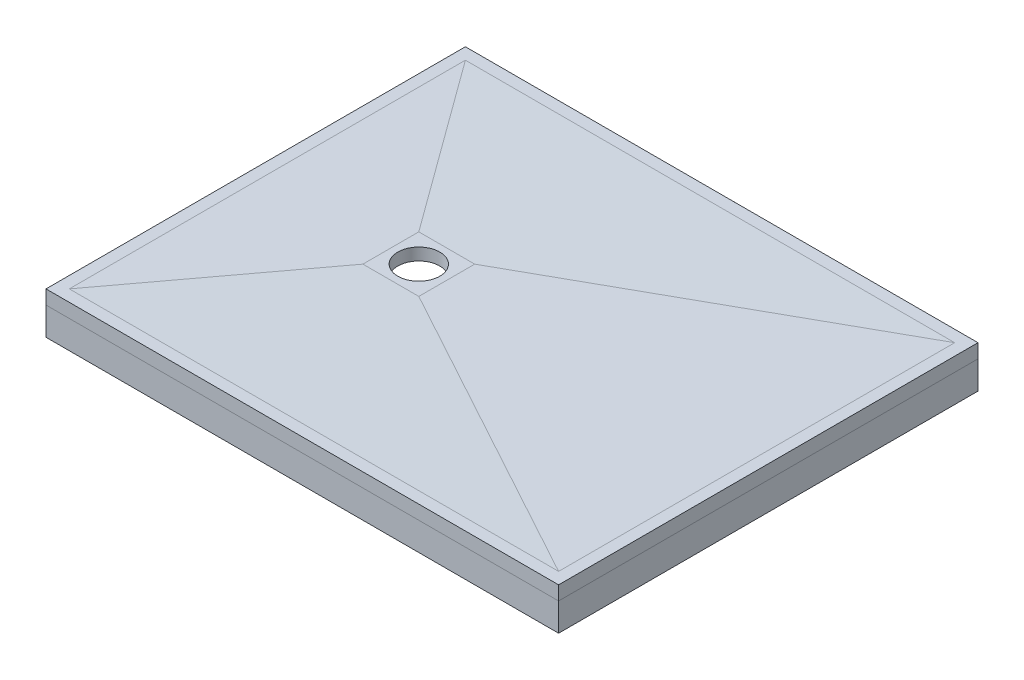
ISO-10303-21;
HEADER;
FILE_DESCRIPTION(('STEP AP214'),'2;1');
FILE_NAME('part.step','',(''),(''),'','','');
FILE_SCHEMA(('AUTOMOTIVE_DESIGN { 1 0 10303 214 1 1 1 1 }'));
ENDSEC;
DATA;
#1=APPLICATION_CONTEXT('core data for automotive mechanical design processes');
#2=APPLICATION_PROTOCOL_DEFINITION('international standard','automotive_design',2000,#1);
#3=PRODUCT_CONTEXT('',#1,'mechanical');
#4=PRODUCT('Part','Part','',(#3));
#5=PRODUCT_RELATED_PRODUCT_CATEGORY('part','',(#4));
#6=PRODUCT_DEFINITION_FORMATION('','',#4);
#7=PRODUCT_DEFINITION_CONTEXT('part definition',#1,'design');
#8=PRODUCT_DEFINITION('design','',#6,#7);
#9=PRODUCT_DEFINITION_SHAPE('','',#8);
#10=(LENGTH_UNIT() NAMED_UNIT(*) SI_UNIT(.MILLI.,.METRE.));
#11=(NAMED_UNIT(*) PLANE_ANGLE_UNIT() SI_UNIT($,.RADIAN.));
#12=(NAMED_UNIT(*) SI_UNIT($,.STERADIAN.) SOLID_ANGLE_UNIT());
#13=UNCERTAINTY_MEASURE_WITH_UNIT(LENGTH_MEASURE(1.E-05),#10,'distance_accuracy_value','');
#14=(GEOMETRIC_REPRESENTATION_CONTEXT(3) GLOBAL_UNCERTAINTY_ASSIGNED_CONTEXT((#13)) GLOBAL_UNIT_ASSIGNED_CONTEXT((#10,
#11,#12)) REPRESENTATION_CONTEXT('',''));
#15=CARTESIAN_POINT('',(0.,0.,0.));
#16=DIRECTION('',(0.,0.,1.));
#17=DIRECTION('',(1.,0.,0.));
#18=AXIS2_PLACEMENT_3D('',#15,#16,#17);
#19=CARTESIAN_POINT('',(0.,-1571.26704035519,0.));
#20=DIRECTION('',(0.,0.,-1.));
#21=DIRECTION('',(-1.,0.,0.));
#22=AXIS2_PLACEMENT_3D('',#19,#20,#21);
#23=PLANE('',#22);
#24=DIRECTION('',(-1.,0.,0.));
#25=VECTOR('',#24,1.);
#26=CARTESIAN_POINT('',(0.,-60.0000000000001,0.));
#27=LINE('',#26,#25);
#28=CARTESIAN_POINT('',(1100.,-60.0000000000001,0.));
#29=VERTEX_POINT('',#28);
#30=CARTESIAN_POINT('',(0.,-60.0000000000001,0.));
#31=VERTEX_POINT('',#30);
#32=EDGE_CURVE('E184',#29,#31,#27,.T.);
#33=ORIENTED_EDGE('',*,*,#32,.F.);
#34=DIRECTION('',(0.,1.,0.));
#35=VECTOR('',#34,1.);
#36=CARTESIAN_POINT('',(1100.,-1571.26704035519,0.));
#37=LINE('',#36,#35);
#38=CARTESIAN_POINT('',(1100.,0.,0.));
#39=VERTEX_POINT('',#38);
#40=EDGE_CURVE('E75',#29,#39,#37,.T.);
#41=ORIENTED_EDGE('',*,*,#40,.T.);
#42=DIRECTION('',(-1.,0.,0.));
#43=VECTOR('',#42,1.);
#44=CARTESIAN_POINT('',(0.,0.,0.));
#45=LINE('',#44,#43);
#46=CARTESIAN_POINT('',(0.,0.,0.));
#47=VERTEX_POINT('',#46);
#48=EDGE_CURVE('E158',#39,#47,#45,.T.);
#49=ORIENTED_EDGE('',*,*,#48,.T.);
#50=DIRECTION('',(0.,1.,0.));
#51=VECTOR('',#50,1.);
#52=CARTESIAN_POINT('',(0.,-1571.26704035519,0.));
#53=LINE('',#52,#51);
#54=EDGE_CURVE('E161',#31,#47,#53,.T.);
#55=ORIENTED_EDGE('',*,*,#54,.F.);
#56=EDGE_LOOP('',(#33,#41,#49,#55));
#57=FACE_BOUND('',#56,.T.);
#58=ADVANCED_FACE('F60',(#57),#23,.F.);
#59=CARTESIAN_POINT('',(1100.,-1571.26704035519,0.));
#60=DIRECTION('',(-1.,0.,0.));
#61=DIRECTION('',(0.,0.,1.));
#62=AXIS2_PLACEMENT_3D('',#59,#60,#61);
#63=PLANE('',#62);
#64=DIRECTION('',(0.,0.,1.));
#65=VECTOR('',#64,1.);
#66=CARTESIAN_POINT('',(1100.,-60.0000000000001,0.));
#67=LINE('',#66,#65);
#68=CARTESIAN_POINT('',(1100.,-60.0000000000001,-900.));
#69=VERTEX_POINT('',#68);
#70=EDGE_CURVE('E187',#69,#29,#67,.T.);
#71=ORIENTED_EDGE('',*,*,#70,.F.);
#72=DIRECTION('',(0.,1.,0.));
#73=VECTOR('',#72,1.);
#74=CARTESIAN_POINT('',(1100.,-1571.26704035519,-900.));
#75=LINE('',#74,#73);
#76=CARTESIAN_POINT('',(1100.,0.,-900.));
#77=VERTEX_POINT('',#76);
#78=EDGE_CURVE('E164',#69,#77,#75,.T.);
#79=ORIENTED_EDGE('',*,*,#78,.T.);
#80=DIRECTION('',(0.,0.,1.));
#81=VECTOR('',#80,1.);
#82=CARTESIAN_POINT('',(1100.,0.,0.));
#83=LINE('',#82,#81);
#84=EDGE_CURVE('E156',#77,#39,#83,.T.);
#85=ORIENTED_EDGE('',*,*,#84,.T.);
#86=ORIENTED_EDGE('',*,*,#40,.F.);
#87=EDGE_LOOP('',(#71,#79,#85,#86));
#88=FACE_BOUND('',#87,.T.);
#89=ADVANCED_FACE('F186',(#88),#63,.F.);
#90=CARTESIAN_POINT('',(0.,-1571.26704035519,-900.));
#91=DIRECTION('',(0.,0.,1.));
#92=DIRECTION('',(1.,0.,0.));
#93=AXIS2_PLACEMENT_3D('',#90,#91,#92);
#94=PLANE('',#93);
#95=DIRECTION('',(1.,0.,0.));
#96=VECTOR('',#95,1.);
#97=CARTESIAN_POINT('',(0.,-60.0000000000001,-900.));
#98=LINE('',#97,#96);
#99=CARTESIAN_POINT('',(0.,-60.0000000000001,-900.));
#100=VERTEX_POINT('',#99);
#101=EDGE_CURVE('E172',#100,#69,#98,.T.);
#102=ORIENTED_EDGE('',*,*,#101,.F.);
#103=DIRECTION('',(0.,1.,0.));
#104=VECTOR('',#103,1.);
#105=CARTESIAN_POINT('',(0.,-1571.26704035519,-900.));
#106=LINE('',#105,#104);
#107=CARTESIAN_POINT('',(0.,0.,-900.));
#108=VERTEX_POINT('',#107);
#109=EDGE_CURVE('E68',#100,#108,#106,.T.);
#110=ORIENTED_EDGE('',*,*,#109,.T.);
#111=DIRECTION('',(1.,0.,0.));
#112=VECTOR('',#111,1.);
#113=CARTESIAN_POINT('',(0.,0.,-900.));
#114=LINE('',#113,#112);
#115=EDGE_CURVE('E153',#108,#77,#114,.T.);
#116=ORIENTED_EDGE('',*,*,#115,.T.);
#117=ORIENTED_EDGE('',*,*,#78,.F.);
#118=EDGE_LOOP('',(#102,#110,#116,#117));
#119=FACE_BOUND('',#118,.T.);
#120=ADVANCED_FACE('F168',(#119),#94,.F.);
#121=CARTESIAN_POINT('',(0.,-1571.26704035519,0.));
#122=DIRECTION('',(1.,0.,0.));
#123=DIRECTION('',(0.,0.,-1.));
#124=AXIS2_PLACEMENT_3D('',#121,#122,#123);
#125=PLANE('',#124);
#126=DIRECTION('',(0.,0.,-1.));
#127=VECTOR('',#126,1.);
#128=CARTESIAN_POINT('',(0.,-60.0000000000001,0.));
#129=LINE('',#128,#127);
#130=EDGE_CURVE('E181',#31,#100,#129,.T.);
#131=ORIENTED_EDGE('',*,*,#130,.F.);
#132=ORIENTED_EDGE('',*,*,#54,.T.);
#133=DIRECTION('',(0.,0.,-1.));
#134=VECTOR('',#133,1.);
#135=CARTESIAN_POINT('',(0.,0.,0.));
#136=LINE('',#135,#134);
#137=EDGE_CURVE('E150',#47,#108,#136,.T.);
#138=ORIENTED_EDGE('',*,*,#137,.T.);
#139=ORIENTED_EDGE('',*,*,#109,.F.);
#140=EDGE_LOOP('',(#131,#132,#138,#139));
#141=FACE_BOUND('',#140,.T.);
#142=ADVANCED_FACE('F62',(#141),#125,.F.);
#143=CARTESIAN_POINT('',(0.,0.,0.));
#144=DIRECTION('',(0.,-1.,0.));
#145=DIRECTION('',(0.,0.,-1.));
#146=AXIS2_PLACEMENT_3D('',#143,#144,#145);
#147=PLANE('',#146);
#148=ORIENTED_EDGE('',*,*,#137,.F.);
#149=ORIENTED_EDGE('',*,*,#48,.F.);
#150=ORIENTED_EDGE('',*,*,#84,.F.);
#151=ORIENTED_EDGE('',*,*,#115,.F.);
#152=EDGE_LOOP('',(#148,#149,#150,#151));
#153=FACE_BOUND('',#152,.T.);
#154=DIRECTION('',(0.,0.,-1.));
#155=VECTOR('',#154,1.);
#156=CARTESIAN_POINT('',(30.,0.,-29.9999999999998));
#157=LINE('',#156,#155);
#158=CARTESIAN_POINT('',(30.,0.,-29.9999999999998));
#159=VERTEX_POINT('',#158);
#160=CARTESIAN_POINT('',(30.0000000000001,0.,-870.));
#161=VERTEX_POINT('',#160);
#162=EDGE_CURVE('E189',#159,#161,#157,.T.);
#163=ORIENTED_EDGE('',*,*,#162,.T.);
#164=DIRECTION('',(1.,0.,0.));
#165=VECTOR('',#164,1.);
#166=CARTESIAN_POINT('',(30.0000000000001,0.,-870.));
#167=LINE('',#166,#165);
#168=CARTESIAN_POINT('',(1070.,0.,-870.));
#169=VERTEX_POINT('',#168);
#170=EDGE_CURVE('E196',#161,#169,#167,.T.);
#171=ORIENTED_EDGE('',*,*,#170,.T.);
#172=DIRECTION('',(0.,0.,1.));
#173=VECTOR('',#172,1.);
#174=CARTESIAN_POINT('',(1070.,0.,-29.9999999999999));
#175=LINE('',#174,#173);
#176=CARTESIAN_POINT('',(1070.,0.,-29.9999999999999));
#177=VERTEX_POINT('',#176);
#178=EDGE_CURVE('E199',#169,#177,#175,.T.);
#179=ORIENTED_EDGE('',*,*,#178,.T.);
#180=DIRECTION('',(-1.,0.,0.));
#181=VECTOR('',#180,1.);
#182=CARTESIAN_POINT('',(30.,0.,-29.9999999999998));
#183=LINE('',#182,#181);
#184=EDGE_CURVE('E140',#177,#159,#183,.T.);
#185=ORIENTED_EDGE('',*,*,#184,.T.);
#186=EDGE_LOOP('',(#163,#171,#179,#185));
#187=FACE_BOUND('',#186,.T.);
#188=ADVANCED_FACE('F178',(#153,#187),#147,.F.);
#189=CARTESIAN_POINT('',(30.,-1571.26704035519,-29.9999999999998));
#190=DIRECTION('',(0.,0.,-1.));
#191=DIRECTION('',(-1.,0.,0.));
#192=AXIS2_PLACEMENT_3D('',#189,#190,#191);
#193=PLANE('',#192);
#194=DIRECTION('',(0.,1.,0.));
#195=VECTOR('',#194,1.);
#196=CARTESIAN_POINT('',(1070.,-1571.26704035519,-29.9999999999999));
#197=LINE('',#196,#195);
#198=CARTESIAN_POINT('',(1070.,-60.0000000000001,-29.9999999999999));
#199=VERTEX_POINT('',#198);
#200=EDGE_CURVE('E132',#199,#177,#197,.T.);
#201=ORIENTED_EDGE('',*,*,#200,.F.);
#202=DIRECTION('',(-1.,0.,0.));
#203=VECTOR('',#202,1.);
#204=CARTESIAN_POINT('',(30.,-60.0000000000001,-29.9999999999998));
#205=LINE('',#204,#203);
#206=CARTESIAN_POINT('',(30.,-60.0000000000001,-29.9999999999998));
#207=VERTEX_POINT('',#206);
#208=EDGE_CURVE('E13',#199,#207,#205,.T.);
#209=ORIENTED_EDGE('',*,*,#208,.T.);
#210=DIRECTION('',(0.,1.,0.));
#211=VECTOR('',#210,1.);
#212=CARTESIAN_POINT('',(30.,-1571.26704035519,-29.9999999999998));
#213=LINE('',#212,#211);
#214=EDGE_CURVE('E142',#207,#159,#213,.T.);
#215=ORIENTED_EDGE('',*,*,#214,.T.);
#216=ORIENTED_EDGE('',*,*,#184,.F.);
#217=EDGE_LOOP('',(#201,#209,#215,#216));
#218=FACE_BOUND('',#217,.T.);
#219=ADVANCED_FACE('F138',(#218),#193,.T.);
#220=CARTESIAN_POINT('',(1070.,-1571.26704035519,-29.9999999999999));
#221=DIRECTION('',(-1.,0.,0.));
#222=DIRECTION('',(0.,0.,1.));
#223=AXIS2_PLACEMENT_3D('',#220,#221,#222);
#224=PLANE('',#223);
#225=DIRECTION('',(0.,1.,0.));
#226=VECTOR('',#225,1.);
#227=CARTESIAN_POINT('',(1070.,-1571.26704035519,-870.));
#228=LINE('',#227,#226);
#229=CARTESIAN_POINT('',(1070.,-60.0000000000001,-870.));
#230=VERTEX_POINT('',#229);
#231=EDGE_CURVE('E134',#230,#169,#228,.T.);
#232=ORIENTED_EDGE('',*,*,#231,.F.);
#233=DIRECTION('',(0.,0.,1.));
#234=VECTOR('',#233,1.);
#235=CARTESIAN_POINT('',(1070.,-60.0000000000001,-29.9999999999999));
#236=LINE('',#235,#234);
#237=EDGE_CURVE('E125',#230,#199,#236,.T.);
#238=ORIENTED_EDGE('',*,*,#237,.T.);
#239=ORIENTED_EDGE('',*,*,#200,.T.);
#240=ORIENTED_EDGE('',*,*,#178,.F.);
#241=EDGE_LOOP('',(#232,#238,#239,#240));
#242=FACE_BOUND('',#241,.T.);
#243=ADVANCED_FACE('F130',(#242),#224,.T.);
#244=CARTESIAN_POINT('',(30.0000000000001,-1571.26704035519,-870.));
#245=DIRECTION('',(0.,0.,1.));
#246=DIRECTION('',(1.,0.,0.));
#247=AXIS2_PLACEMENT_3D('',#244,#245,#246);
#248=PLANE('',#247);
#249=DIRECTION('',(0.,1.,0.));
#250=VECTOR('',#249,1.);
#251=CARTESIAN_POINT('',(30.0000000000001,-1571.26704035519,-870.));
#252=LINE('',#251,#250);
#253=CARTESIAN_POINT('',(30.0000000000001,-60.0000000000001,-870.));
#254=VERTEX_POINT('',#253);
#255=EDGE_CURVE('E144',#254,#161,#252,.T.);
#256=ORIENTED_EDGE('',*,*,#255,.F.);
#257=DIRECTION('',(1.,0.,0.));
#258=VECTOR('',#257,1.);
#259=CARTESIAN_POINT('',(30.0000000000001,-60.0000000000001,-870.));
#260=LINE('',#259,#258);
#261=EDGE_CURVE('E136',#254,#230,#260,.T.);
#262=ORIENTED_EDGE('',*,*,#261,.T.);
#263=ORIENTED_EDGE('',*,*,#231,.T.);
#264=ORIENTED_EDGE('',*,*,#170,.F.);
#265=EDGE_LOOP('',(#256,#262,#263,#264));
#266=FACE_BOUND('',#265,.T.);
#267=ADVANCED_FACE('F204',(#266),#248,.T.);
#268=CARTESIAN_POINT('',(30.,-1571.26704035519,-29.9999999999998));
#269=DIRECTION('',(1.,0.,0.));
#270=DIRECTION('',(0.,0.,-1.));
#271=AXIS2_PLACEMENT_3D('',#268,#269,#270);
#272=PLANE('',#271);
#273=ORIENTED_EDGE('',*,*,#214,.F.);
#274=DIRECTION('',(0.,0.,-1.));
#275=VECTOR('',#274,1.);
#276=CARTESIAN_POINT('',(30.,-60.0000000000001,-29.9999999999998));
#277=LINE('',#276,#275);
#278=EDGE_CURVE('E83',#207,#254,#277,.T.);
#279=ORIENTED_EDGE('',*,*,#278,.T.);
#280=ORIENTED_EDGE('',*,*,#255,.T.);
#281=ORIENTED_EDGE('',*,*,#162,.F.);
#282=EDGE_LOOP('',(#273,#279,#280,#281));
#283=FACE_BOUND('',#282,.T.);
#284=ADVANCED_FACE('F208',(#283),#272,.T.);
#285=CARTESIAN_POINT('',(0.,-60.,0.));
#286=DIRECTION('',(0.,-1.,0.));
#287=DIRECTION('',(0.,0.,-1.));
#288=AXIS2_PLACEMENT_3D('',#285,#286,#287);
#289=PLANE('',#288);
#290=ORIENTED_EDGE('',*,*,#278,.F.);
#291=ORIENTED_EDGE('',*,*,#208,.F.);
#292=ORIENTED_EDGE('',*,*,#237,.F.);
#293=ORIENTED_EDGE('',*,*,#261,.F.);
#294=EDGE_LOOP('',(#290,#291,#292,#293));
#295=FACE_BOUND('',#294,.T.);
#296=ORIENTED_EDGE('',*,*,#32,.T.);
#297=ORIENTED_EDGE('',*,*,#130,.T.);
#298=ORIENTED_EDGE('',*,*,#101,.T.);
#299=ORIENTED_EDGE('',*,*,#70,.T.);
#300=EDGE_LOOP('',(#296,#297,#298,#299));
#301=FACE_BOUND('',#300,.T.);
#302=ADVANCED_FACE('F123',(#295,#301),#289,.T.);
#303=CLOSED_SHELL('',(#58,#89,#120,#142,#188,#219,#243,#267,#284,#302));
#304=MANIFOLD_SOLID_BREP('B2',#303);
#305=CARTESIAN_POINT('',(0.,30.,0.));
#306=DIRECTION('',(0.,-1.,0.));
#307=DIRECTION('',(0.,0.,-1.));
#308=AXIS2_PLACEMENT_3D('',#305,#306,#307);
#309=PLANE('',#308);
#310=DIRECTION('',(0.,0.,1.));
#311=VECTOR('',#310,1.);
#312=CARTESIAN_POINT('',(0.,30.,0.));
#313=LINE('',#312,#311);
#314=CARTESIAN_POINT('',(0.,30.,-900.));
#315=VERTEX_POINT('',#314);
#316=CARTESIAN_POINT('',(0.,30.,0.));
#317=VERTEX_POINT('',#316);
#318=EDGE_CURVE('E494',#315,#317,#313,.T.);
#319=ORIENTED_EDGE('',*,*,#318,.T.);
#320=DIRECTION('',(1.,0.,0.));
#321=VECTOR('',#320,1.);
#322=CARTESIAN_POINT('',(0.,30.,0.));
#323=LINE('',#322,#321);
#324=CARTESIAN_POINT('',(1100.,30.,0.));
#325=VERTEX_POINT('',#324);
#326=EDGE_CURVE('E347',#317,#325,#323,.T.);
#327=ORIENTED_EDGE('',*,*,#326,.T.);
#328=DIRECTION('',(0.,0.,-1.));
#329=VECTOR('',#328,1.);
#330=CARTESIAN_POINT('',(1100.,30.,0.));
#331=LINE('',#330,#329);
#332=CARTESIAN_POINT('',(1100.,30.,-900.));
#333=VERTEX_POINT('',#332);
#334=EDGE_CURVE('E504',#325,#333,#331,.T.);
#335=ORIENTED_EDGE('',*,*,#334,.T.);
#336=DIRECTION('',(-1.,0.,0.));
#337=VECTOR('',#336,1.);
#338=CARTESIAN_POINT('',(0.,30.,-900.));
#339=LINE('',#338,#337);
#340=EDGE_CURVE('E319',#333,#315,#339,.T.);
#341=ORIENTED_EDGE('',*,*,#340,.T.);
#342=EDGE_LOOP('',(#319,#327,#335,#341));
#343=FACE_BOUND('',#342,.T.);
#344=DIRECTION('',(-1.,0.,0.));
#345=VECTOR('',#344,1.);
#346=CARTESIAN_POINT('',(24.9999999999997,30.,-875.));
#347=LINE('',#346,#345);
#348=CARTESIAN_POINT('',(1075.,30.,-875.));
#349=VERTEX_POINT('',#348);
#350=CARTESIAN_POINT('',(24.9999999999997,30.,-875.));
#351=VERTEX_POINT('',#350);
#352=EDGE_CURVE('E371',#349,#351,#347,.T.);
#353=ORIENTED_EDGE('',*,*,#352,.F.);
#354=DIRECTION('',(0.,0.,-1.));
#355=VECTOR('',#354,1.);
#356=CARTESIAN_POINT('',(1075.,30.,-875.));
#357=LINE('',#356,#355);
#358=CARTESIAN_POINT('',(1075.,30.,-25.0000000000001));
#359=VERTEX_POINT('',#358);
#360=EDGE_CURVE('E384',#359,#349,#357,.T.);
#361=ORIENTED_EDGE('',*,*,#360,.F.);
#362=DIRECTION('',(1.,0.,0.));
#363=VECTOR('',#362,1.);
#364=CARTESIAN_POINT('',(24.9999999999998,30.,-24.9999999999999));
#365=LINE('',#364,#363);
#366=CARTESIAN_POINT('',(24.9999999999998,30.,-24.999999999999));
#367=VERTEX_POINT('',#366);
#368=EDGE_CURVE('E400',#367,#359,#365,.T.);
#369=ORIENTED_EDGE('',*,*,#368,.F.);
#370=DIRECTION('',(0.,0.,1.));
#371=VECTOR('',#370,1.);
#372=CARTESIAN_POINT('',(24.9999999999997,30.,-875.));
#373=LINE('',#372,#371);
#374=EDGE_CURVE('E295',#351,#367,#373,.T.);
#375=ORIENTED_EDGE('',*,*,#374,.F.);
#376=EDGE_LOOP('',(#353,#361,#369,#375));
#377=FACE_BOUND('',#376,.T.);
#378=ADVANCED_FACE('F291',(#343,#377),#309,.F.);
#379=CARTESIAN_POINT('',(0.,30.,0.));
#380=DIRECTION('',(1.,0.,0.));
#381=DIRECTION('',(0.,0.,-1.));
#382=AXIS2_PLACEMENT_3D('',#379,#380,#381);
#383=PLANE('',#382);
#384=DIRECTION('',(0.,0.,1.));
#385=VECTOR('',#384,1.);
#386=CARTESIAN_POINT('',(0.,0.,0.));
#387=LINE('',#386,#385);
#388=CARTESIAN_POINT('',(0.,0.,-900.));
#389=VERTEX_POINT('',#388);
#390=CARTESIAN_POINT('',(0.,0.,0.));
#391=VERTEX_POINT('',#390);
#392=EDGE_CURVE('E465',#389,#391,#387,.T.);
#393=ORIENTED_EDGE('',*,*,#392,.T.);
#394=DIRECTION('',(0.,-1.,0.));
#395=VECTOR('',#394,1.);
#396=CARTESIAN_POINT('',(0.,30.,0.));
#397=LINE('',#396,#395);
#398=EDGE_CURVE('E58',#317,#391,#397,.T.);
#399=ORIENTED_EDGE('',*,*,#398,.F.);
#400=ORIENTED_EDGE('',*,*,#318,.F.);
#401=DIRECTION('',(0.,-1.,0.));
#402=VECTOR('',#401,1.);
#403=CARTESIAN_POINT('',(0.,30.,-900.));
#404=LINE('',#403,#402);
#405=EDGE_CURVE('E509',#315,#389,#404,.T.);
#406=ORIENTED_EDGE('',*,*,#405,.T.);
#407=EDGE_LOOP('',(#393,#399,#400,#406));
#408=FACE_BOUND('',#407,.T.);
#409=ADVANCED_FACE('F293',(#408),#383,.F.);
#410=CARTESIAN_POINT('',(0.,30.,0.));
#411=DIRECTION('',(0.,0.,-1.));
#412=DIRECTION('',(-1.,0.,0.));
#413=AXIS2_PLACEMENT_3D('',#410,#411,#412);
#414=PLANE('',#413);
#415=DIRECTION('',(1.,0.,0.));
#416=VECTOR('',#415,1.);
#417=CARTESIAN_POINT('',(0.,0.,0.));
#418=LINE('',#417,#416);
#419=CARTESIAN_POINT('',(1100.,0.,0.));
#420=VERTEX_POINT('',#419);
#421=EDGE_CURVE('E513',#391,#420,#418,.T.);
#422=ORIENTED_EDGE('',*,*,#421,.T.);
#423=DIRECTION('',(0.,-1.,0.));
#424=VECTOR('',#423,1.);
#425=CARTESIAN_POINT('',(1100.,30.,0.));
#426=LINE('',#425,#424);
#427=EDGE_CURVE('E302',#325,#420,#426,.T.);
#428=ORIENTED_EDGE('',*,*,#427,.F.);
#429=ORIENTED_EDGE('',*,*,#326,.F.);
#430=ORIENTED_EDGE('',*,*,#398,.T.);
#431=EDGE_LOOP('',(#422,#428,#429,#430));
#432=FACE_BOUND('',#431,.T.);
#433=ADVANCED_FACE('F545',(#432),#414,.F.);
#434=CARTESIAN_POINT('',(1100.,30.,0.));
#435=DIRECTION('',(-1.,0.,0.));
#436=DIRECTION('',(0.,0.,1.));
#437=AXIS2_PLACEMENT_3D('',#434,#435,#436);
#438=PLANE('',#437);
#439=DIRECTION('',(0.,0.,-1.));
#440=VECTOR('',#439,1.);
#441=CARTESIAN_POINT('',(1100.,0.,0.));
#442=LINE('',#441,#440);
#443=CARTESIAN_POINT('',(1100.,0.,-900.));
#444=VERTEX_POINT('',#443);
#445=EDGE_CURVE('E516',#420,#444,#442,.T.);
#446=ORIENTED_EDGE('',*,*,#445,.T.);
#447=DIRECTION('',(0.,-1.,0.));
#448=VECTOR('',#447,1.);
#449=CARTESIAN_POINT('',(1100.,30.,-900.));
#450=LINE('',#449,#448);
#451=EDGE_CURVE('E523',#333,#444,#450,.T.);
#452=ORIENTED_EDGE('',*,*,#451,.F.);
#453=ORIENTED_EDGE('',*,*,#334,.F.);
#454=ORIENTED_EDGE('',*,*,#427,.T.);
#455=EDGE_LOOP('',(#446,#452,#453,#454));
#456=FACE_BOUND('',#455,.T.);
#457=ADVANCED_FACE('F531',(#456),#438,.F.);
#458=CARTESIAN_POINT('',(0.,30.,-900.));
#459=DIRECTION('',(0.,0.,1.));
#460=DIRECTION('',(1.,0.,0.));
#461=AXIS2_PLACEMENT_3D('',#458,#459,#460);
#462=PLANE('',#461);
#463=DIRECTION('',(-1.,0.,0.));
#464=VECTOR('',#463,1.);
#465=CARTESIAN_POINT('',(0.,0.,-900.));
#466=LINE('',#465,#464);
#467=EDGE_CURVE('E340',#444,#389,#466,.T.);
#468=ORIENTED_EDGE('',*,*,#467,.T.);
#469=ORIENTED_EDGE('',*,*,#405,.F.);
#470=ORIENTED_EDGE('',*,*,#340,.F.);
#471=ORIENTED_EDGE('',*,*,#451,.T.);
#472=EDGE_LOOP('',(#468,#469,#470,#471));
#473=FACE_BOUND('',#472,.T.);
#474=ADVANCED_FACE('F538',(#473),#462,.F.);
#475=CARTESIAN_POINT('',(0.,0.,0.));
#476=DIRECTION('',(0.,-1.,0.));
#477=DIRECTION('',(0.,0.,-1.));
#478=AXIS2_PLACEMENT_3D('',#475,#476,#477);
#479=PLANE('',#478);
#480=CARTESIAN_POINT('',(350.,0.,-450.));
#481=DIRECTION('',(0.,1.,0.));
#482=DIRECTION('',(0.,0.,1.));
#483=AXIS2_PLACEMENT_3D('',#480,#481,#482);
#484=CIRCLE('',#483,45.);
#485=CARTESIAN_POINT('',(350.,0.,-405.));
#486=VERTEX_POINT('',#485);
#487=EDGE_CURVE('E403',#486,#486,#484,.T.);
#488=ORIENTED_EDGE('',*,*,#487,.T.);
#489=EDGE_LOOP('',(#488));
#490=FACE_BOUND('',#489,.T.);
#491=ORIENTED_EDGE('',*,*,#392,.F.);
#492=ORIENTED_EDGE('',*,*,#467,.F.);
#493=ORIENTED_EDGE('',*,*,#445,.F.);
#494=ORIENTED_EDGE('',*,*,#421,.F.);
#495=EDGE_LOOP('',(#491,#492,#493,#494));
#496=FACE_BOUND('',#495,.T.);
#497=ADVANCED_FACE('F425',(#490,#496),#479,.T.);
#498=CARTESIAN_POINT('',(0.,26.,0.));
#499=DIRECTION('',(0.,-1.,0.));
#500=DIRECTION('',(0.,0.,-1.));
#501=AXIS2_PLACEMENT_3D('',#498,#499,#500);
#502=PLANE('',#501);
#503=CARTESIAN_POINT('',(350.,26.,-450.));
#504=DIRECTION('',(0.,1.,0.));
#505=DIRECTION('',(0.,0.,1.));
#506=AXIS2_PLACEMENT_3D('',#503,#504,#505);
#507=CIRCLE('',#506,45.);
#508=CARTESIAN_POINT('',(350.,26.,-405.));
#509=VERTEX_POINT('',#508);
#510=EDGE_CURVE('E785',#509,#509,#507,.T.);
#511=ORIENTED_EDGE('',*,*,#510,.F.);
#512=EDGE_LOOP('',(#511));
#513=FACE_BOUND('',#512,.T.);
#514=DIRECTION('',(0.,0.,-1.));
#515=VECTOR('',#514,1.);
#516=CARTESIAN_POINT('',(410.,26.,-390.));
#517=LINE('',#516,#515);
#518=CARTESIAN_POINT('',(410.,26.,-390.));
#519=VERTEX_POINT('',#518);
#520=CARTESIAN_POINT('',(410.,26.,-510.));
#521=VERTEX_POINT('',#520);
#522=EDGE_CURVE('E457',#519,#521,#517,.T.);
#523=ORIENTED_EDGE('',*,*,#522,.T.);
#524=DIRECTION('',(-1.,0.,0.));
#525=VECTOR('',#524,1.);
#526=CARTESIAN_POINT('',(290.,26.,-510.));
#527=LINE('',#526,#525);
#528=CARTESIAN_POINT('',(290.,26.,-510.));
#529=VERTEX_POINT('',#528);
#530=EDGE_CURVE('E482',#521,#529,#527,.T.);
#531=ORIENTED_EDGE('',*,*,#530,.T.);
#532=DIRECTION('',(0.,0.,1.));
#533=VECTOR('',#532,1.);
#534=CARTESIAN_POINT('',(290.,26.,-390.));
#535=LINE('',#534,#533);
#536=CARTESIAN_POINT('',(290.,26.,-390.));
#537=VERTEX_POINT('',#536);
#538=EDGE_CURVE('E390',#529,#537,#535,.T.);
#539=ORIENTED_EDGE('',*,*,#538,.T.);
#540=DIRECTION('',(1.,0.,0.));
#541=VECTOR('',#540,1.);
#542=CARTESIAN_POINT('',(290.,26.,-390.));
#543=LINE('',#542,#541);
#544=EDGE_CURVE('E460',#537,#519,#543,.T.);
#545=ORIENTED_EDGE('',*,*,#544,.T.);
#546=EDGE_LOOP('',(#523,#531,#539,#545));
#547=FACE_BOUND('',#546,.T.);
#548=ADVANCED_FACE('F422',(#513,#547),#502,.F.);
#549=CARTESIAN_POINT('',(0.,20.408507891715,0.223654881005096));
#550=DIRECTION('',(0.,0.999939956618603,0.0109582460999299));
#551=DIRECTION('',(0.,-0.0109582460999299,0.999939956618603));
#552=AXIS2_PLACEMENT_3D('',#549,#550,#551);
#553=PLANE('',#552);
#554=CARTESIAN_POINT('',(1075.,30.,-875.));
#555=DIRECTION('',(-0.876620879532352,-0.00527290754605926,0.481152813577907));
#556=VECTOR('',#555,1.);
#557=LINE('',#554,#556);
#558=EDGE_CURVE('E377',#349,#521,#557,.T.);
#559=ORIENTED_EDGE('',*,*,#558,.F.);
#560=ORIENTED_EDGE('',*,*,#352,.T.);
#561=CARTESIAN_POINT('',(24.9999999999997,30.,-875.));
#562=DIRECTION('',(0.587489285320048,-0.00886776279728373,0.80918335525214));
#563=VECTOR('',#562,1.);
#564=LINE('',#561,#563);
#565=EDGE_CURVE('E374',#351,#529,#564,.T.);
#566=ORIENTED_EDGE('',*,*,#565,.T.);
#567=ORIENTED_EDGE('',*,*,#530,.F.);
#568=EDGE_LOOP('',(#559,#560,#566,#567));
#569=FACE_BOUND('',#568,.T.);
#570=ADVANCED_FACE('F373',(#569),#553,.T.);
#571=CARTESIAN_POINT('',(0.458421719508549,30.3704389174414,0.));
#572=DIRECTION('',(0.0150926203761279,0.999886099918477,0.));
#573=DIRECTION('',(-0.999886099918477,0.0150926203761279,0.));
#574=AXIS2_PLACEMENT_3D('',#571,#572,#573);
#575=PLANE('',#574);
#576=ORIENTED_EDGE('',*,*,#565,.F.);
#577=ORIENTED_EDGE('',*,*,#374,.T.);
#578=CARTESIAN_POINT('',(24.9999999999998,30.,-24.9999999999999));
#579=DIRECTION('',(0.587489285320047,-0.00886776279728372,-0.80918335525214));
#580=VECTOR('',#579,1.);
#581=LINE('',#578,#580);
#582=EDGE_CURVE('E682',#367,#537,#581,.T.);
#583=ORIENTED_EDGE('',*,*,#582,.T.);
#584=ORIENTED_EDGE('',*,*,#538,.F.);
#585=EDGE_LOOP('',(#576,#577,#583,#584));
#586=FACE_BOUND('',#585,.T.);
#587=ADVANCED_FACE('F388',(#586),#575,.T.);
#588=CARTESIAN_POINT('',(-0.141551778329011,23.532983147198,0.));
#589=DIRECTION('',(0.00601492878287066,-0.999981910152247,0.));
#590=DIRECTION('',(0.999981910152247,0.00601492878287066,0.));
#591=AXIS2_PLACEMENT_3D('',#588,#589,#590);
#592=PLANE('',#591);
#593=CARTESIAN_POINT('',(1075.,30.,-25.0000000000002));
#594=DIRECTION('',(-0.876620879532352,-0.00527290754605926,-0.481152813577907));
#595=VECTOR('',#594,1.);
#596=LINE('',#593,#595);
#597=EDGE_CURVE('E394',#359,#519,#596,.T.);
#598=ORIENTED_EDGE('',*,*,#597,.F.);
#599=ORIENTED_EDGE('',*,*,#360,.T.);
#600=ORIENTED_EDGE('',*,*,#558,.T.);
#601=ORIENTED_EDGE('',*,*,#522,.F.);
#602=EDGE_LOOP('',(#598,#599,#600,#601));
#603=FACE_BOUND('',#602,.T.);
#604=ADVANCED_FACE('F580',(#603),#592,.F.);
#605=CARTESIAN_POINT('',(0.,30.2703372085169,-0.331729722833062));
#606=DIRECTION('',(0.,0.999939956618603,-0.0109582460999299));
#607=DIRECTION('',(0.,0.0109582460999299,0.999939956618603));
#608=AXIS2_PLACEMENT_3D('',#605,#606,#607);
#609=PLANE('',#608);
#610=ORIENTED_EDGE('',*,*,#582,.F.);
#611=ORIENTED_EDGE('',*,*,#368,.T.);
#612=ORIENTED_EDGE('',*,*,#597,.T.);
#613=ORIENTED_EDGE('',*,*,#544,.F.);
#614=EDGE_LOOP('',(#610,#611,#612,#613));
#615=FACE_BOUND('',#614,.T.);
#616=ADVANCED_FACE('F589',(#615),#609,.T.);
#617=CARTESIAN_POINT('',(350.,0.,-450.));
#618=DIRECTION('',(0.,1.,0.));
#619=DIRECTION('',(0.,0.,1.));
#620=AXIS2_PLACEMENT_3D('',#617,#618,#619);
#621=CYLINDRICAL_SURFACE('',#620,45.);
#622=CARTESIAN_POINT('',(350.,0.,-405.));
#623=CARTESIAN_POINT('',(350.,0.270833333333333,-405.));
#624=CARTESIAN_POINT('',(350.,0.541666666666667,-405.));
#625=CARTESIAN_POINT('',(350.,1.08333333333333,-405.));
#626=CARTESIAN_POINT('',(350.,1.35416666666667,-405.));
#627=CARTESIAN_POINT('',(350.,1.89583333333333,-405.));
#628=CARTESIAN_POINT('',(350.,2.16666666666667,-405.));
#629=CARTESIAN_POINT('',(350.,2.70833333333333,-405.));
#630=CARTESIAN_POINT('',(350.,2.97916666666667,-405.));
#631=CARTESIAN_POINT('',(350.,3.52083333333333,-405.));
#632=CARTESIAN_POINT('',(350.,3.79166666666667,-405.));
#633=CARTESIAN_POINT('',(350.,4.33333333333333,-405.));
#634=CARTESIAN_POINT('',(350.,4.60416666666667,-405.));
#635=CARTESIAN_POINT('',(350.,5.14583333333333,-405.));
#636=CARTESIAN_POINT('',(350.,5.41666666666667,-405.));
#637=CARTESIAN_POINT('',(350.,5.95833333333333,-405.));
#638=CARTESIAN_POINT('',(350.,6.22916666666667,-405.));
#639=CARTESIAN_POINT('',(350.,6.77083333333333,-405.));
#640=CARTESIAN_POINT('',(350.,7.04166666666667,-405.));
#641=CARTESIAN_POINT('',(350.,7.58333333333333,-405.));
#642=CARTESIAN_POINT('',(350.,7.85416666666667,-405.));
#643=CARTESIAN_POINT('',(350.,8.39583333333333,-405.));
#644=CARTESIAN_POINT('',(350.,8.66666666666667,-405.));
#645=CARTESIAN_POINT('',(350.,9.20833333333333,-405.));
#646=CARTESIAN_POINT('',(350.,9.47916666666667,-405.));
#647=CARTESIAN_POINT('',(350.,10.0208333333333,-405.));
#648=CARTESIAN_POINT('',(350.,10.2916666666667,-405.));
#649=CARTESIAN_POINT('',(350.,10.8333333333333,-405.));
#650=CARTESIAN_POINT('',(350.,11.1041666666667,-405.));
#651=CARTESIAN_POINT('',(350.,11.6458333333333,-405.));
#652=CARTESIAN_POINT('',(350.,11.9166666666667,-405.));
#653=CARTESIAN_POINT('',(350.,12.4583333333333,-405.));
#654=CARTESIAN_POINT('',(350.,12.7291666666667,-405.));
#655=CARTESIAN_POINT('',(350.,13.2708333333333,-405.));
#656=CARTESIAN_POINT('',(350.,13.5416666666667,-405.));
#657=CARTESIAN_POINT('',(350.,14.0833333333333,-405.));
#658=CARTESIAN_POINT('',(350.,14.3541666666667,-405.));
#659=CARTESIAN_POINT('',(350.,14.8958333333333,-405.));
#660=CARTESIAN_POINT('',(350.,15.1666666666667,-405.));
#661=CARTESIAN_POINT('',(350.,15.7083333333333,-405.));
#662=CARTESIAN_POINT('',(350.,15.9791666666667,-405.));
#663=CARTESIAN_POINT('',(350.,16.5208333333333,-405.));
#664=CARTESIAN_POINT('',(350.,16.7916666666667,-405.));
#665=CARTESIAN_POINT('',(350.,17.3333333333333,-405.));
#666=CARTESIAN_POINT('',(350.,17.6041666666667,-405.));
#667=CARTESIAN_POINT('',(350.,18.1458333333333,-405.));
#668=CARTESIAN_POINT('',(350.,18.4166666666667,-405.));
#669=CARTESIAN_POINT('',(350.,18.9583333333333,-405.));
#670=CARTESIAN_POINT('',(350.,19.2291666666667,-405.));
#671=CARTESIAN_POINT('',(350.,19.7708333333333,-405.));
#672=CARTESIAN_POINT('',(350.,20.0416666666667,-405.));
#673=CARTESIAN_POINT('',(350.,20.5833333333333,-405.));
#674=CARTESIAN_POINT('',(350.,20.8541666666667,-405.));
#675=CARTESIAN_POINT('',(350.,21.3958333333333,-405.));
#676=CARTESIAN_POINT('',(350.,21.6666666666667,-405.));
#677=CARTESIAN_POINT('',(350.,22.2083333333333,-405.));
#678=CARTESIAN_POINT('',(350.,22.4791666666667,-405.));
#679=CARTESIAN_POINT('',(350.,23.0208333333333,-405.));
#680=CARTESIAN_POINT('',(350.,23.2916666666667,-405.));
#681=CARTESIAN_POINT('',(350.,23.8333333333333,-405.));
#682=CARTESIAN_POINT('',(350.,24.1041666666667,-405.));
#683=CARTESIAN_POINT('',(350.,24.6458333333333,-405.));
#684=CARTESIAN_POINT('',(350.,24.9166666666667,-405.));
#685=CARTESIAN_POINT('',(350.,25.4583333333333,-405.));
#686=CARTESIAN_POINT('',(350.,25.7291666666667,-405.));
#687=CARTESIAN_POINT('',(350.,26.,-405.));
#688=B_SPLINE_CURVE_WITH_KNOTS('',3,(#622,#623,#624,#625,#626,#627,#628,#629,#630,#631,#632,
#633,#634,#635,#636,#637,#638,#639,#640,#641,#642,#643,#644,#645,#646,#647,#648,#649,#650,#651,
#652,#653,#654,#655,#656,#657,#658,#659,#660,#661,#662,#663,#664,#665,#666,#667,#668,#669,#670,
#671,#672,#673,#674,#675,#676,#677,#678,#679,#680,#681,#682,#683,#684,#685,#686,#687),
.UNSPECIFIED.,.F.,.F.,(4,2,2,2,2,2,2,2,2,2,2,2,2,2,2,2,2,2,2,2,2,2,2,2,2,2,2,2,2,2,2,2,4),(0.,
0.8125,1.625,2.4375,3.25,4.0625,4.875,5.6875,6.5,7.3125,8.125,8.9375,9.75,10.5625,11.375,
12.1875,13.,13.8125,14.625,15.4375,16.25,17.0625,17.875,18.6875,19.5,20.3125,21.125,21.9375,
22.75,23.5625,24.375,25.1875,26.),.UNSPECIFIED.);
#689=EDGE_CURVE('BSEAM598',#486,#509,#688,.T.);
#690=ORIENTED_EDGE('',*,*,#487,.F.);
#691=ORIENTED_EDGE('',*,*,#510,.T.);
#692=ORIENTED_EDGE('',*,*,#689,.T.);
#693=ORIENTED_EDGE('',*,*,#689,.F.);
#694=EDGE_LOOP('',(#690,#692,#691,#693));
#695=FACE_BOUND('',#694,.T.);
#696=ADVANCED_FACE('F598',(#695),#621,.F.);
#697=CLOSED_SHELL('',(#378,#409,#433,#457,#474,#497,#548,#570,#587,#604,#616,#696));
#698=MANIFOLD_SOLID_BREP('B7',#697);
#699=ADVANCED_BREP_SHAPE_REPRESENTATION('',(#18,#304,#698),#14);
#700=SHAPE_DEFINITION_REPRESENTATION(#9,#699);
ENDSEC;
END-ISO-10303-21;
